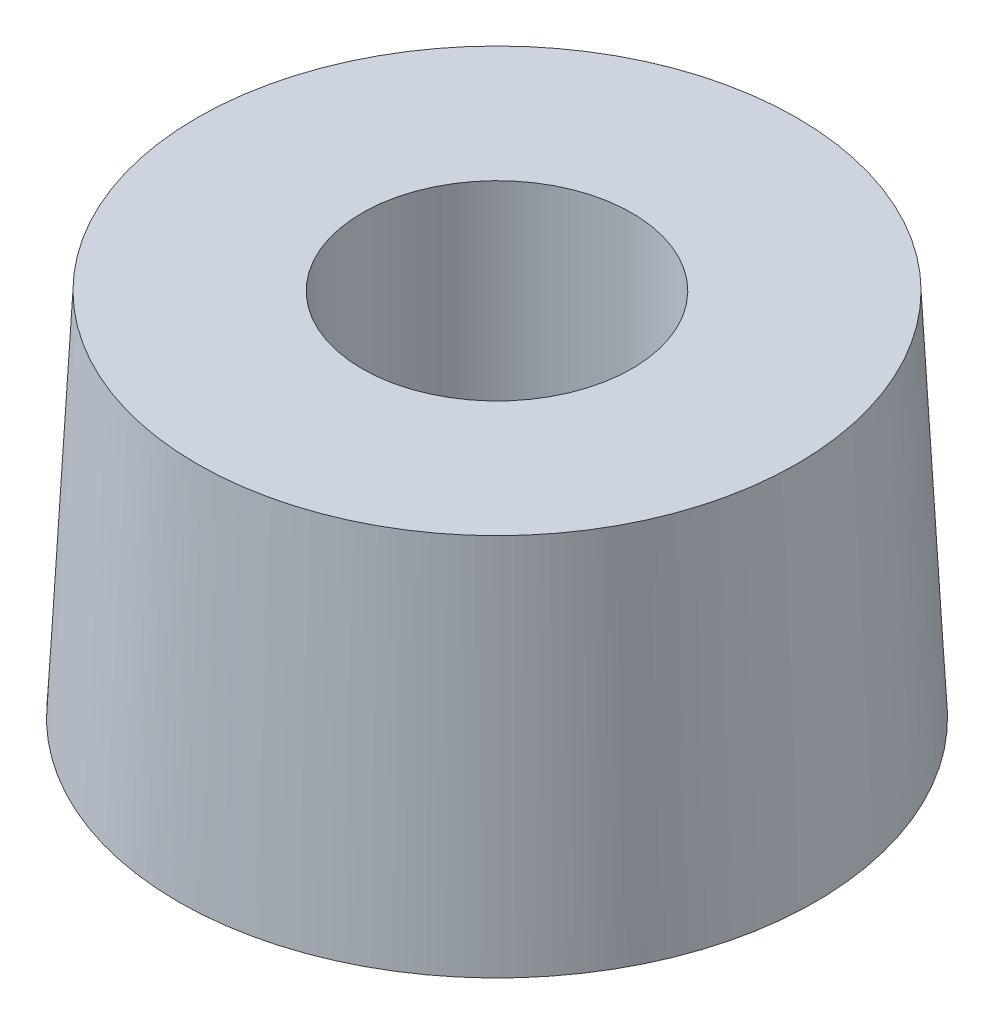
ISO-10303-21;
HEADER;
FILE_DESCRIPTION(('STEP AP214'),'2;1');
FILE_NAME('part.step','',(''),(''),'','','');
FILE_SCHEMA(('AUTOMOTIVE_DESIGN { 1 0 10303 214 1 1 1 1 }'));
ENDSEC;
DATA;
#1=APPLICATION_CONTEXT('core data for automotive mechanical design processes');
#2=APPLICATION_PROTOCOL_DEFINITION('international standard','automotive_design',2000,#1);
#3=PRODUCT_CONTEXT('',#1,'mechanical');
#4=PRODUCT('Part','Part','',(#3));
#5=PRODUCT_RELATED_PRODUCT_CATEGORY('part','',(#4));
#6=PRODUCT_DEFINITION_FORMATION('','',#4);
#7=PRODUCT_DEFINITION_CONTEXT('part definition',#1,'design');
#8=PRODUCT_DEFINITION('design','',#6,#7);
#9=PRODUCT_DEFINITION_SHAPE('','',#8);
#10=(LENGTH_UNIT() NAMED_UNIT(*) SI_UNIT(.MILLI.,.METRE.));
#11=(NAMED_UNIT(*) PLANE_ANGLE_UNIT() SI_UNIT($,.RADIAN.));
#12=(NAMED_UNIT(*) SI_UNIT($,.STERADIAN.) SOLID_ANGLE_UNIT());
#13=UNCERTAINTY_MEASURE_WITH_UNIT(LENGTH_MEASURE(1.E-05),#10,'distance_accuracy_value','');
#14=(GEOMETRIC_REPRESENTATION_CONTEXT(3) GLOBAL_UNCERTAINTY_ASSIGNED_CONTEXT((#13)) GLOBAL_UNIT_ASSIGNED_CONTEXT((#10,
#11,#12)) REPRESENTATION_CONTEXT('',''));
#15=CARTESIAN_POINT('',(0.,0.,0.));
#16=DIRECTION('',(0.,0.,1.));
#17=DIRECTION('',(1.,0.,0.));
#18=AXIS2_PLACEMENT_3D('',#15,#16,#17);
#19=CARTESIAN_POINT('',(0.,0.,0.));
#20=DIRECTION('',(0.,1.,0.));
#21=DIRECTION('',(0.,0.,1.));
#22=AXIS2_PLACEMENT_3D('',#19,#20,#21);
#23=PLANE('',#22);
#24=CARTESIAN_POINT('',(0.,0.,0.));
#25=DIRECTION('',(0.,1.,0.));
#26=DIRECTION('',(0.,0.,1.));
#27=AXIS2_PLACEMENT_3D('',#24,#25,#26);
#28=CIRCLE('',#27,5.4);
#29=CARTESIAN_POINT('',(0.,0.,5.4));
#30=VERTEX_POINT('',#29);
#31=EDGE_CURVE('E50',#30,#30,#28,.T.);
#32=ORIENTED_EDGE('',*,*,#31,.T.);
#33=EDGE_LOOP('',(#32));
#34=FACE_BOUND('',#33,.T.);
#35=CARTESIAN_POINT('',(0.,0.,0.));
#36=DIRECTION('',(0.,1.,0.));
#37=DIRECTION('',(0.,0.,1.));
#38=AXIS2_PLACEMENT_3D('',#35,#36,#37);
#39=CIRCLE('',#38,12.75);
#40=CARTESIAN_POINT('',(0.,0.,12.75));
#41=VERTEX_POINT('',#40);
#42=EDGE_CURVE('E44',#41,#41,#39,.T.);
#43=ORIENTED_EDGE('',*,*,#42,.F.);
#44=EDGE_LOOP('',(#43));
#45=FACE_BOUND('',#44,.T.);
#46=ADVANCED_FACE('F36',(#34,#45),#23,.F.);
#47=CARTESIAN_POINT('',(0.,14.8,0.));
#48=DIRECTION('',(0.,1.,0.));
#49=DIRECTION('',(0.,0.,1.));
#50=AXIS2_PLACEMENT_3D('',#47,#48,#49);
#51=PLANE('',#50);
#52=CARTESIAN_POINT('',(0.,14.8,0.));
#53=DIRECTION('',(0.,1.,0.));
#54=DIRECTION('',(0.,0.,1.));
#55=AXIS2_PLACEMENT_3D('',#52,#53,#54);
#56=CIRCLE('',#55,5.4);
#57=CARTESIAN_POINT('',(0.,14.8,5.4));
#58=VERTEX_POINT('',#57);
#59=EDGE_CURVE('E105',#58,#58,#56,.T.);
#60=ORIENTED_EDGE('',*,*,#59,.F.);
#61=EDGE_LOOP('',(#60));
#62=FACE_BOUND('',#61,.T.);
#63=CARTESIAN_POINT('',(0.,14.8,0.));
#64=DIRECTION('',(0.,1.,0.));
#65=DIRECTION('',(0.,0.,1.));
#66=AXIS2_PLACEMENT_3D('',#63,#64,#65);
#67=CIRCLE('',#66,12.);
#68=CARTESIAN_POINT('',(0.,14.8,12.));
#69=VERTEX_POINT('',#68);
#70=EDGE_CURVE('E11',#69,#69,#67,.T.);
#71=ORIENTED_EDGE('',*,*,#70,.T.);
#72=EDGE_LOOP('',(#71));
#73=FACE_BOUND('',#72,.T.);
#74=ADVANCED_FACE('F86',(#62,#73),#51,.T.);
#75=CARTESIAN_POINT('',(0.,14.8,0.));
#76=DIRECTION('',(0.,-1.,0.));
#77=DIRECTION('',(0.,0.,-1.));
#78=AXIS2_PLACEMENT_3D('',#75,#76,#77);
#79=CONICAL_SURFACE('',#78,12.,0.0506323636064171);
#80=ORIENTED_EDGE('',*,*,#70,.F.);
#81=EDGE_LOOP('',(#80));
#82=FACE_BOUND('',#81,.T.);
#83=ORIENTED_EDGE('',*,*,#42,.T.);
#84=EDGE_LOOP('',(#83));
#85=FACE_BOUND('',#84,.T.);
#86=ADVANCED_FACE('F70',(#82,#85),#79,.T.);
#87=CARTESIAN_POINT('',(0.,-9.99999999994061E-05,0.));
#88=DIRECTION('',(0.,1.,0.));
#89=DIRECTION('',(0.,0.,1.));
#90=AXIS2_PLACEMENT_3D('',#87,#88,#89);
#91=CYLINDRICAL_SURFACE('',#90,5.4);
#92=ORIENTED_EDGE('',*,*,#59,.T.);
#93=EDGE_LOOP('',(#92));
#94=FACE_BOUND('',#93,.T.);
#95=ORIENTED_EDGE('',*,*,#31,.F.);
#96=EDGE_LOOP('',(#95));
#97=FACE_BOUND('',#96,.T.);
#98=ADVANCED_FACE('F85',(#94,#97),#91,.F.);
#99=CLOSED_SHELL('',(#46,#74,#86,#98));
#100=MANIFOLD_SOLID_BREP('B2',#99);
#101=ADVANCED_BREP_SHAPE_REPRESENTATION('',(#18,#100),#14);
#102=SHAPE_DEFINITION_REPRESENTATION(#9,#101);
ENDSEC;
END-ISO-10303-21;
